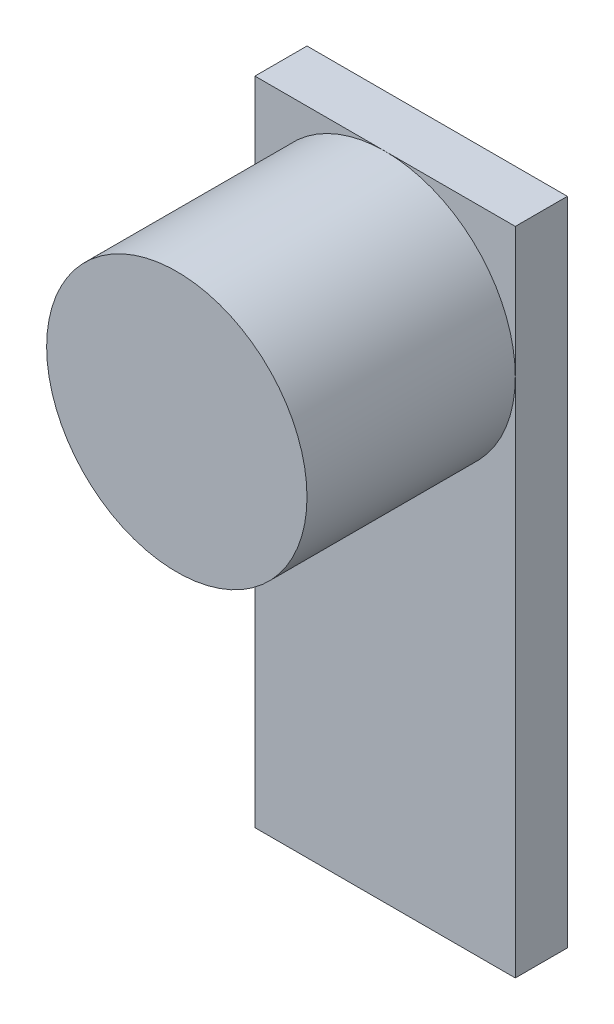
ISO-10303-21;
HEADER;
FILE_DESCRIPTION(('STEP AP214'),'2;1');
FILE_NAME('part.step','',(''),(''),'','','');
FILE_SCHEMA(('AUTOMOTIVE_DESIGN { 1 0 10303 214 1 1 1 1 }'));
ENDSEC;
DATA;
#1=APPLICATION_CONTEXT('core data for automotive mechanical design processes');
#2=APPLICATION_PROTOCOL_DEFINITION('international standard','automotive_design',2000,#1);
#3=PRODUCT_CONTEXT('',#1,'mechanical');
#4=PRODUCT('Part','Part','',(#3));
#5=PRODUCT_RELATED_PRODUCT_CATEGORY('part','',(#4));
#6=PRODUCT_DEFINITION_FORMATION('','',#4);
#7=PRODUCT_DEFINITION_CONTEXT('part definition',#1,'design');
#8=PRODUCT_DEFINITION('design','',#6,#7);
#9=PRODUCT_DEFINITION_SHAPE('','',#8);
#10=(LENGTH_UNIT() NAMED_UNIT(*) SI_UNIT(.MILLI.,.METRE.));
#11=(NAMED_UNIT(*) PLANE_ANGLE_UNIT() SI_UNIT($,.RADIAN.));
#12=(NAMED_UNIT(*) SI_UNIT($,.STERADIAN.) SOLID_ANGLE_UNIT());
#13=UNCERTAINTY_MEASURE_WITH_UNIT(LENGTH_MEASURE(1.E-05),#10,'distance_accuracy_value','');
#14=(GEOMETRIC_REPRESENTATION_CONTEXT(3) GLOBAL_UNCERTAINTY_ASSIGNED_CONTEXT((#13)) GLOBAL_UNIT_ASSIGNED_CONTEXT((#10,
#11,#12)) REPRESENTATION_CONTEXT('',''));
#15=CARTESIAN_POINT('',(0.,0.,0.));
#16=DIRECTION('',(0.,0.,1.));
#17=DIRECTION('',(1.,0.,0.));
#18=AXIS2_PLACEMENT_3D('',#15,#16,#17);
#19=CARTESIAN_POINT('',(0.,0.,10000.));
#20=DIRECTION('',(0.,0.,-1.));
#21=DIRECTION('',(-1.,0.,0.));
#22=AXIS2_PLACEMENT_3D('',#19,#20,#21);
#23=CYLINDRICAL_SURFACE('',#22,5000.);
#24=CARTESIAN_POINT('',(0.,0.,2000.));
#25=DIRECTION('',(0.,0.,1.));
#26=DIRECTION('',(1.,0.,0.));
#27=AXIS2_PLACEMENT_3D('',#24,#25,#26);
#28=CIRCLE('',#27,5000.);
#29=CARTESIAN_POINT('',(-5000.,0.,2000.));
#30=VERTEX_POINT('',#29);
#31=CARTESIAN_POINT('',(5000.,0.,2000.));
#32=VERTEX_POINT('',#31);
#33=EDGE_CURVE('E36',#30,#32,#28,.T.);
#34=ORIENTED_EDGE('',*,*,#33,.T.);
#35=CARTESIAN_POINT('',(0.,5000.,2000.));
#36=VERTEX_POINT('',#35);
#37=EDGE_CURVE('E11',#32,#36,#28,.T.);
#38=ORIENTED_EDGE('',*,*,#37,.T.);
#39=EDGE_CURVE('E41',#36,#30,#28,.T.);
#40=ORIENTED_EDGE('',*,*,#39,.T.);
#41=EDGE_LOOP('',(#34,#38,#40));
#42=FACE_BOUND('',#41,.T.);
#43=CARTESIAN_POINT('',(0.,0.,10000.));
#44=DIRECTION('',(0.,0.,1.));
#45=DIRECTION('',(1.,0.,0.));
#46=AXIS2_PLACEMENT_3D('',#43,#44,#45);
#47=CIRCLE('',#46,5000.);
#48=CARTESIAN_POINT('',(5000.,0.,10000.));
#49=VERTEX_POINT('',#48);
#50=EDGE_CURVE('E104',#49,#49,#47,.T.);
#51=ORIENTED_EDGE('',*,*,#50,.F.);
#52=EDGE_LOOP('',(#51));
#53=FACE_BOUND('',#52,.T.);
#54=ADVANCED_FACE('F33',(#42,#53),#23,.T.);
#55=CARTESIAN_POINT('',(0.,0.,10000.));
#56=DIRECTION('',(0.,0.,1.));
#57=DIRECTION('',(1.,0.,0.));
#58=AXIS2_PLACEMENT_3D('',#55,#56,#57);
#59=PLANE('',#58);
#60=ORIENTED_EDGE('',*,*,#50,.T.);
#61=EDGE_LOOP('',(#60));
#62=FACE_BOUND('',#61,.T.);
#63=ADVANCED_FACE('F142',(#62),#59,.T.);
#64=CARTESIAN_POINT('',(0.,0.,2000.));
#65=DIRECTION('',(0.,0.,1.));
#66=DIRECTION('',(1.,0.,0.));
#67=AXIS2_PLACEMENT_3D('',#64,#65,#66);
#68=PLANE('',#67);
#69=ORIENTED_EDGE('',*,*,#37,.F.);
#70=DIRECTION('',(0.,-1.,0.));
#71=VECTOR('',#70,1.);
#72=CARTESIAN_POINT('',(5000.,5000.,2000.));
#73=LINE('',#72,#71);
#74=CARTESIAN_POINT('',(5000.,5000.,2000.));
#75=VERTEX_POINT('',#74);
#76=EDGE_CURVE('E48',#75,#32,#73,.T.);
#77=ORIENTED_EDGE('',*,*,#76,.F.);
#78=DIRECTION('',(-1.,0.,0.));
#79=VECTOR('',#78,1.);
#80=CARTESIAN_POINT('',(5000.,5000.,2000.));
#81=LINE('',#80,#79);
#82=EDGE_CURVE('E88',#75,#36,#81,.T.);
#83=ORIENTED_EDGE('',*,*,#82,.T.);
#84=EDGE_LOOP('',(#69,#77,#83));
#85=FACE_BOUND('',#84,.T.);
#86=ADVANCED_FACE('F138',(#85),#68,.T.);
#87=ORIENTED_EDGE('',*,*,#39,.F.);
#88=CARTESIAN_POINT('',(-5000.,5000.,2000.));
#89=VERTEX_POINT('',#88);
#90=EDGE_CURVE('E80',#36,#89,#81,.T.);
#91=ORIENTED_EDGE('',*,*,#90,.T.);
#92=DIRECTION('',(0.,-1.,0.));
#93=VECTOR('',#92,1.);
#94=CARTESIAN_POINT('',(-5000.,5000.,2000.));
#95=LINE('',#94,#93);
#96=EDGE_CURVE('E83',#89,#30,#95,.T.);
#97=ORIENTED_EDGE('',*,*,#96,.T.);
#98=EDGE_LOOP('',(#87,#91,#97));
#99=FACE_BOUND('',#98,.T.);
#100=ADVANCED_FACE('F82',(#99),#68,.T.);
#101=CARTESIAN_POINT('',(5000.,5000.,2000.));
#102=DIRECTION('',(0.,-1.,0.));
#103=DIRECTION('',(0.,0.,-1.));
#104=AXIS2_PLACEMENT_3D('',#101,#102,#103);
#105=PLANE('',#104);
#106=ORIENTED_EDGE('',*,*,#90,.F.);
#107=ORIENTED_EDGE('',*,*,#82,.F.);
#108=DIRECTION('',(0.,0.,-1.));
#109=VECTOR('',#108,1.);
#110=CARTESIAN_POINT('',(5000.,5000.,2000.));
#111=LINE('',#110,#109);
#112=CARTESIAN_POINT('',(5000.,5000.,0.));
#113=VERTEX_POINT('',#112);
#114=EDGE_CURVE('E114',#75,#113,#111,.T.);
#115=ORIENTED_EDGE('',*,*,#114,.T.);
#116=DIRECTION('',(-1.,0.,0.));
#117=VECTOR('',#116,1.);
#118=CARTESIAN_POINT('',(5000.,5000.,0.));
#119=LINE('',#118,#117);
#120=CARTESIAN_POINT('',(-5000.,5000.,0.));
#121=VERTEX_POINT('',#120);
#122=EDGE_CURVE('E103',#113,#121,#119,.T.);
#123=ORIENTED_EDGE('',*,*,#122,.T.);
#124=DIRECTION('',(0.,0.,-1.));
#125=VECTOR('',#124,1.);
#126=CARTESIAN_POINT('',(-5000.,5000.,2000.));
#127=LINE('',#126,#125);
#128=EDGE_CURVE('E95',#89,#121,#127,.T.);
#129=ORIENTED_EDGE('',*,*,#128,.F.);
#130=EDGE_LOOP('',(#106,#107,#115,#123,#129));
#131=FACE_BOUND('',#130,.T.);
#132=ADVANCED_FACE('F101',(#131),#105,.F.);
#133=CARTESIAN_POINT('',(-5000.,5000.,2000.));
#134=DIRECTION('',(1.,0.,0.));
#135=DIRECTION('',(0.,0.,-1.));
#136=AXIS2_PLACEMENT_3D('',#133,#134,#135);
#137=PLANE('',#136);
#138=CARTESIAN_POINT('',(-5000.,-20000.,2000.));
#139=VERTEX_POINT('',#138);
#140=EDGE_CURVE('E97',#30,#139,#95,.T.);
#141=ORIENTED_EDGE('',*,*,#140,.F.);
#142=ORIENTED_EDGE('',*,*,#96,.F.);
#143=ORIENTED_EDGE('',*,*,#128,.T.);
#144=DIRECTION('',(0.,-1.,0.));
#145=VECTOR('',#144,1.);
#146=CARTESIAN_POINT('',(-5000.,5000.,0.));
#147=LINE('',#146,#145);
#148=CARTESIAN_POINT('',(-5000.,-20000.,0.));
#149=VERTEX_POINT('',#148);
#150=EDGE_CURVE('E120',#121,#149,#147,.T.);
#151=ORIENTED_EDGE('',*,*,#150,.T.);
#152=DIRECTION('',(0.,0.,-1.));
#153=VECTOR('',#152,1.);
#154=CARTESIAN_POINT('',(-5000.,-20000.,2000.));
#155=LINE('',#154,#153);
#156=EDGE_CURVE('E105',#139,#149,#155,.T.);
#157=ORIENTED_EDGE('',*,*,#156,.F.);
#158=EDGE_LOOP('',(#141,#142,#143,#151,#157));
#159=FACE_BOUND('',#158,.T.);
#160=ADVANCED_FACE('F94',(#159),#137,.F.);
#161=CARTESIAN_POINT('',(5000.,5000.,2000.));
#162=DIRECTION('',(1.,0.,0.));
#163=DIRECTION('',(0.,0.,-1.));
#164=AXIS2_PLACEMENT_3D('',#161,#162,#163);
#165=PLANE('',#164);
#166=DIRECTION('',(0.,0.,-1.));
#167=VECTOR('',#166,1.);
#168=CARTESIAN_POINT('',(5000.,-20000.,2000.));
#169=LINE('',#168,#167);
#170=CARTESIAN_POINT('',(5000.,-20000.,2000.));
#171=VERTEX_POINT('',#170);
#172=CARTESIAN_POINT('',(5000.,-20000.,0.));
#173=VERTEX_POINT('',#172);
#174=EDGE_CURVE('E109',#171,#173,#169,.T.);
#175=ORIENTED_EDGE('',*,*,#174,.T.);
#176=DIRECTION('',(0.,-1.,0.));
#177=VECTOR('',#176,1.);
#178=CARTESIAN_POINT('',(5000.,5000.,0.));
#179=LINE('',#178,#177);
#180=EDGE_CURVE('E89',#113,#173,#179,.T.);
#181=ORIENTED_EDGE('',*,*,#180,.F.);
#182=ORIENTED_EDGE('',*,*,#114,.F.);
#183=ORIENTED_EDGE('',*,*,#76,.T.);
#184=EDGE_CURVE('E124',#32,#171,#73,.T.);
#185=ORIENTED_EDGE('',*,*,#184,.T.);
#186=EDGE_LOOP('',(#175,#181,#182,#183,#185));
#187=FACE_BOUND('',#186,.T.);
#188=ADVANCED_FACE('F137',(#187),#165,.T.);
#189=CARTESIAN_POINT('',(5000.,-20000.,2000.));
#190=DIRECTION('',(0.,-1.,0.));
#191=DIRECTION('',(0.,0.,-1.));
#192=AXIS2_PLACEMENT_3D('',#189,#190,#191);
#193=PLANE('',#192);
#194=DIRECTION('',(-1.,0.,0.));
#195=VECTOR('',#194,1.);
#196=CARTESIAN_POINT('',(5000.,-20000.,0.));
#197=LINE('',#196,#195);
#198=EDGE_CURVE('E117',#173,#149,#197,.T.);
#199=ORIENTED_EDGE('',*,*,#198,.F.);
#200=ORIENTED_EDGE('',*,*,#174,.F.);
#201=DIRECTION('',(-1.,0.,0.));
#202=VECTOR('',#201,1.);
#203=CARTESIAN_POINT('',(5000.,-20000.,2000.));
#204=LINE('',#203,#202);
#205=EDGE_CURVE('E98',#171,#139,#204,.T.);
#206=ORIENTED_EDGE('',*,*,#205,.T.);
#207=ORIENTED_EDGE('',*,*,#156,.T.);
#208=EDGE_LOOP('',(#199,#200,#206,#207));
#209=FACE_BOUND('',#208,.T.);
#210=ADVANCED_FACE('F135',(#209),#193,.T.);
#211=ORIENTED_EDGE('',*,*,#33,.F.);
#212=ORIENTED_EDGE('',*,*,#140,.T.);
#213=ORIENTED_EDGE('',*,*,#205,.F.);
#214=ORIENTED_EDGE('',*,*,#184,.F.);
#215=EDGE_LOOP('',(#211,#212,#213,#214));
#216=FACE_BOUND('',#215,.T.);
#217=ADVANCED_FACE('F130',(#216),#68,.T.);
#218=CARTESIAN_POINT('',(0.,0.,0.));
#219=DIRECTION('',(0.,0.,1.));
#220=DIRECTION('',(1.,0.,0.));
#221=AXIS2_PLACEMENT_3D('',#218,#219,#220);
#222=PLANE('',#221);
#223=ORIENTED_EDGE('',*,*,#122,.F.);
#224=ORIENTED_EDGE('',*,*,#180,.T.);
#225=ORIENTED_EDGE('',*,*,#198,.T.);
#226=ORIENTED_EDGE('',*,*,#150,.F.);
#227=EDGE_LOOP('',(#223,#224,#225,#226));
#228=FACE_BOUND('',#227,.T.);
#229=ADVANCED_FACE('F153',(#228),#222,.F.);
#230=CLOSED_SHELL('',(#54,#63,#86,#100,#132,#160,#188,#210,#217,#229));
#231=MANIFOLD_SOLID_BREP('B2',#230);
#232=ADVANCED_BREP_SHAPE_REPRESENTATION('',(#18,#231),#14);
#233=SHAPE_DEFINITION_REPRESENTATION(#9,#232);
ENDSEC;
END-ISO-10303-21;
